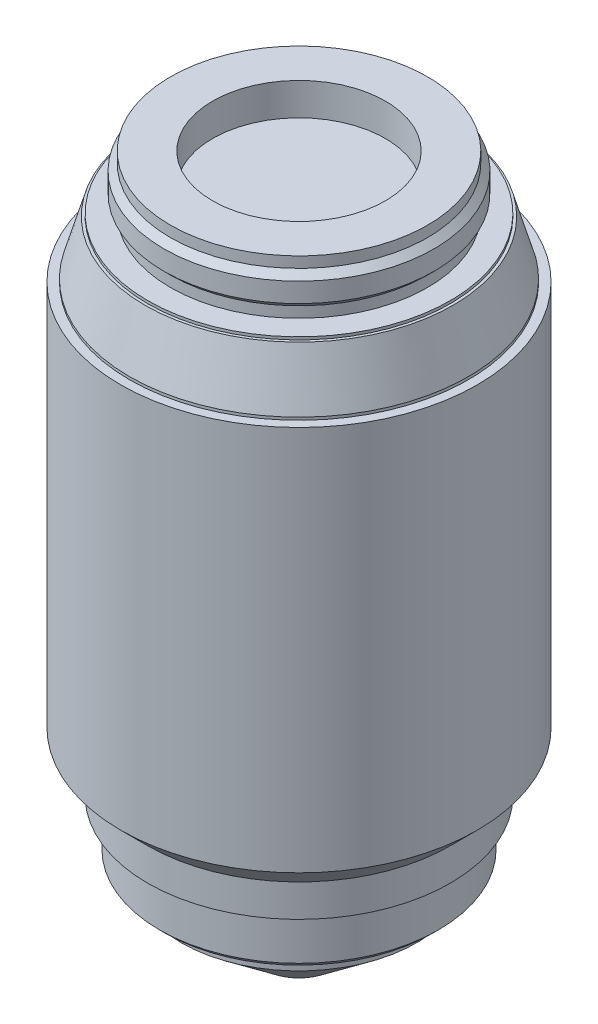
ISO-10303-21;
HEADER;
FILE_DESCRIPTION(('STEP AP214'),'2;1');
FILE_NAME('part.step','',(''),(''),'','','');
FILE_SCHEMA(('AUTOMOTIVE_DESIGN { 1 0 10303 214 1 1 1 1 }'));
ENDSEC;
DATA;
#1=APPLICATION_CONTEXT('core data for automotive mechanical design processes');
#2=APPLICATION_PROTOCOL_DEFINITION('international standard','automotive_design',2000,#1);
#3=PRODUCT_CONTEXT('',#1,'mechanical');
#4=PRODUCT('Part','Part','',(#3));
#5=PRODUCT_RELATED_PRODUCT_CATEGORY('part','',(#4));
#6=PRODUCT_DEFINITION_FORMATION('','',#4);
#7=PRODUCT_DEFINITION_CONTEXT('part definition',#1,'design');
#8=PRODUCT_DEFINITION('design','',#6,#7);
#9=PRODUCT_DEFINITION_SHAPE('','',#8);
#10=(LENGTH_UNIT() NAMED_UNIT(*) SI_UNIT(.MILLI.,.METRE.));
#11=(NAMED_UNIT(*) PLANE_ANGLE_UNIT() SI_UNIT($,.RADIAN.));
#12=(NAMED_UNIT(*) SI_UNIT($,.STERADIAN.) SOLID_ANGLE_UNIT());
#13=UNCERTAINTY_MEASURE_WITH_UNIT(LENGTH_MEASURE(1.E-05),#10,'distance_accuracy_value','');
#14=(GEOMETRIC_REPRESENTATION_CONTEXT(3) GLOBAL_UNCERTAINTY_ASSIGNED_CONTEXT((#13)) GLOBAL_UNIT_ASSIGNED_CONTEXT((#10,
#11,#12)) REPRESENTATION_CONTEXT('',''));
#15=CARTESIAN_POINT('',(0.,0.,0.));
#16=DIRECTION('',(0.,0.,1.));
#17=DIRECTION('',(1.,0.,0.));
#18=AXIS2_PLACEMENT_3D('',#15,#16,#17);
#19=CARTESIAN_POINT('',(0.,32.,11.9));
#20=DIRECTION('',(0.,1.,0.));
#21=DIRECTION('',(0.,0.,1.));
#22=AXIS2_PLACEMENT_3D('',#19,#20,#21);
#23=PLANE('',#22);
#24=CARTESIAN_POINT('',(0.,32.,0.));
#25=DIRECTION('',(0.,1.,0.));
#26=DIRECTION('',(0.,0.,1.));
#27=AXIS2_PLACEMENT_3D('',#24,#25,#26);
#28=CIRCLE('',#27,8.);
#29=CARTESIAN_POINT('',(0.,32.,8.00000000000001));
#30=VERTEX_POINT('',#29);
#31=EDGE_CURVE('E116',#30,#30,#28,.T.);
#32=ORIENTED_EDGE('',*,*,#31,.F.);
#33=EDGE_LOOP('',(#32));
#34=FACE_BOUND('',#33,.T.);
#35=CARTESIAN_POINT('',(0.,32.,0.));
#36=DIRECTION('',(0.,1.,0.));
#37=DIRECTION('',(0.,0.,1.));
#38=AXIS2_PLACEMENT_3D('',#35,#36,#37);
#39=CIRCLE('',#38,11.9);
#40=CARTESIAN_POINT('',(0.,32.,11.9));
#41=VERTEX_POINT('',#40);
#42=EDGE_CURVE('E112',#41,#41,#39,.T.);
#43=ORIENTED_EDGE('',*,*,#42,.T.);
#44=EDGE_LOOP('',(#43));
#45=FACE_BOUND('',#44,.T.);
#46=ADVANCED_FACE('F45',(#34,#45),#23,.T.);
#47=CARTESIAN_POINT('',(0.,-32.,0.));
#48=DIRECTION('',(0.,-1.,0.));
#49=DIRECTION('',(0.,0.,-1.));
#50=AXIS2_PLACEMENT_3D('',#47,#48,#49);
#51=PLANE('',#50);
#52=CARTESIAN_POINT('',(0.,-32.,0.));
#53=DIRECTION('',(0.,-1.,0.));
#54=DIRECTION('',(0.,0.,-1.));
#55=AXIS2_PLACEMENT_3D('',#52,#53,#54);
#56=CIRCLE('',#55,2.5);
#57=CARTESIAN_POINT('',(0.,-32.,-2.50000000000001));
#58=VERTEX_POINT('',#57);
#59=EDGE_CURVE('E122',#58,#58,#56,.T.);
#60=ORIENTED_EDGE('',*,*,#59,.F.);
#61=EDGE_LOOP('',(#60));
#62=FACE_BOUND('',#61,.T.);
#63=CARTESIAN_POINT('',(0.,-32.,0.));
#64=DIRECTION('',(0.,1.,0.));
#65=DIRECTION('',(0.,0.,1.));
#66=AXIS2_PLACEMENT_3D('',#63,#64,#65);
#67=CIRCLE('',#66,3.25);
#68=CARTESIAN_POINT('',(0.,-32.,3.24999999999999));
#69=VERTEX_POINT('',#68);
#70=EDGE_CURVE('E10',#69,#69,#67,.T.);
#71=ORIENTED_EDGE('',*,*,#70,.F.);
#72=EDGE_LOOP('',(#71));
#73=FACE_BOUND('',#72,.T.);
#74=ADVANCED_FACE('F137',(#62,#73),#51,.T.);
#75=CARTESIAN_POINT('',(0.,-26.0231649572236,0.));
#76=DIRECTION('',(0.,1.,0.));
#77=DIRECTION('',(0.,0.,1.));
#78=AXIS2_PLACEMENT_3D('',#75,#76,#77);
#79=CONICAL_SURFACE('',#78,10.9,0.90757121103705);
#80=CARTESIAN_POINT('',(0.,-26.0231649572236,0.));
#81=DIRECTION('',(0.,1.,0.));
#82=DIRECTION('',(0.,0.,1.));
#83=AXIS2_PLACEMENT_3D('',#80,#81,#82);
#84=CIRCLE('',#83,10.9);
#85=CARTESIAN_POINT('',(0.,-26.0231649572236,10.9));
#86=VERTEX_POINT('',#85);
#87=EDGE_CURVE('E51',#86,#86,#84,.T.);
#88=CARTESIAN_POINT('',(0.,-32.,3.24999999999999));
#89=CARTESIAN_POINT('',(0.,-31.9377413016378,3.32968749999999));
#90=CARTESIAN_POINT('',(0.,-31.8754826032755,3.40937499999999));
#91=CARTESIAN_POINT('',(0.,-31.750965206551,3.56874999999999));
#92=CARTESIAN_POINT('',(0.,-31.6887065081887,3.64843749999999));
#93=CARTESIAN_POINT('',(0.,-31.5641891114642,3.80781249999999));
#94=CARTESIAN_POINT('',(0.,-31.501930413102,3.88749999999999));
#95=CARTESIAN_POINT('',(0.,-31.3774130163775,4.04687499999999));
#96=CARTESIAN_POINT('',(0.,-31.3151543180152,4.12656249999999));
#97=CARTESIAN_POINT('',(0.,-31.1906369212907,4.28593749999999));
#98=CARTESIAN_POINT('',(0.,-31.1283782229284,4.36562499999999));
#99=CARTESIAN_POINT('',(0.,-31.0038608262039,4.52499999999999));
#100=CARTESIAN_POINT('',(0.,-30.9416021278417,4.60468749999999));
#101=CARTESIAN_POINT('',(0.,-30.8170847311172,4.76406249999999));
#102=CARTESIAN_POINT('',(0.,-30.7548260327549,4.84374999999999));
#103=CARTESIAN_POINT('',(0.,-30.6303086360304,5.00312499999999));
#104=CARTESIAN_POINT('',(0.,-30.5680499376682,5.08281249999999));
#105=CARTESIAN_POINT('',(0.,-30.4435325409437,5.24218749999999));
#106=CARTESIAN_POINT('',(0.,-30.3812738425814,5.32187499999999));
#107=CARTESIAN_POINT('',(0.,-30.2567564458569,5.48124999999999));
#108=CARTESIAN_POINT('',(0.,-30.1944977474946,5.56093749999999));
#109=CARTESIAN_POINT('',(0.,-30.0699803507701,5.72031249999999));
#110=CARTESIAN_POINT('',(0.,-30.0077216524079,5.79999999999999));
#111=CARTESIAN_POINT('',(0.,-29.8832042556834,5.95937499999999));
#112=CARTESIAN_POINT('',(0.,-29.8209455573211,6.03906249999999));
#113=CARTESIAN_POINT('',(0.,-29.6964281605966,6.19843749999999));
#114=CARTESIAN_POINT('',(0.,-29.6341694622344,6.27812499999999));
#115=CARTESIAN_POINT('',(0.,-29.5096520655098,6.43749999999999));
#116=CARTESIAN_POINT('',(0.,-29.4473933671476,6.51718749999999));
#117=CARTESIAN_POINT('',(0.,-29.3228759704231,6.67656249999999));
#118=CARTESIAN_POINT('',(0.,-29.2606172720608,6.75624999999999));
#119=CARTESIAN_POINT('',(0.,-29.1360998753363,6.91562499999999));
#120=CARTESIAN_POINT('',(0.,-29.0738411769741,6.99531249999999));
#121=CARTESIAN_POINT('',(0.,-28.9493237802496,7.15468749999999));
#122=CARTESIAN_POINT('',(0.,-28.8870650818873,7.23437499999999));
#123=CARTESIAN_POINT('',(0.,-28.7625476851628,7.39374999999999));
#124=CARTESIAN_POINT('',(0.,-28.7002889868005,7.47343749999999));
#125=CARTESIAN_POINT('',(0.,-28.575771590076,7.63281249999999));
#126=CARTESIAN_POINT('',(0.,-28.5135128917138,7.71249999999999));
#127=CARTESIAN_POINT('',(0.,-28.3889954949893,7.87187499999999));
#128=CARTESIAN_POINT('',(0.,-28.326736796627,7.95156249999999));
#129=CARTESIAN_POINT('',(0.,-28.2022193999025,8.11093749999999));
#130=CARTESIAN_POINT('',(0.,-28.1399607015402,8.19062499999999));
#131=CARTESIAN_POINT('',(0.,-28.0154433048157,8.34999999999999));
#132=CARTESIAN_POINT('',(0.,-27.9531846064535,8.42968749999999));
#133=CARTESIAN_POINT('',(0.,-27.828667209729,8.58906249999999));
#134=CARTESIAN_POINT('',(0.,-27.7664085113667,8.66874999999999));
#135=CARTESIAN_POINT('',(0.,-27.6418911146422,8.82812499999999));
#136=CARTESIAN_POINT('',(0.,-27.57963241628,8.90781249999999));
#137=CARTESIAN_POINT('',(0.,-27.4551150195554,9.06718749999999));
#138=CARTESIAN_POINT('',(0.,-27.3928563211932,9.146875));
#139=CARTESIAN_POINT('',(0.,-27.2683389244687,9.30625));
#140=CARTESIAN_POINT('',(0.,-27.2060802261064,9.3859375));
#141=CARTESIAN_POINT('',(0.,-27.0815628293819,9.54531249999999));
#142=CARTESIAN_POINT('',(0.,-27.0193041310197,9.62499999999999));
#143=CARTESIAN_POINT('',(0.,-26.8947867342952,9.78437499999999));
#144=CARTESIAN_POINT('',(0.,-26.8325280359329,9.86406249999999));
#145=CARTESIAN_POINT('',(0.,-26.7080106392084,10.0234375));
#146=CARTESIAN_POINT('',(0.,-26.6457519408461,10.103125));
#147=CARTESIAN_POINT('',(0.,-26.5212345441216,10.2625));
#148=CARTESIAN_POINT('',(0.,-26.4589758457594,10.3421875));
#149=CARTESIAN_POINT('',(0.,-26.3344584490349,10.5015625));
#150=CARTESIAN_POINT('',(0.,-26.2721997506726,10.58125));
#151=CARTESIAN_POINT('',(0.,-26.1476823539481,10.740625));
#152=CARTESIAN_POINT('',(0.,-26.0854236555859,10.8203125));
#153=CARTESIAN_POINT('',(0.,-26.0231649572236,10.9));
#154=B_SPLINE_CURVE_WITH_KNOTS('',3,(#88,#89,#90,#91,#92,#93,#94,#95,#96,#97,#98,#99,#100,#101,
#102,#103,#104,#105,#106,#107,#108,#109,#110,#111,#112,#113,#114,#115,#116,#117,#118,#119,#120,
#121,#122,#123,#124,#125,#126,#127,#128,#129,#130,#131,#132,#133,#134,#135,#136,#137,#138,#139,
#140,#141,#142,#143,#144,#145,#146,#147,#148,#149,#150,#151,#152,#153),.UNSPECIFIED.,.F.,.F.,(4,
2,2,2,2,2,2,2,2,2,2,2,2,2,2,2,2,2,2,2,2,2,2,2,2,2,2,2,2,2,2,2,4),(0.,0.30337466704079,
0.60674933408158,0.91012400112237,1.21349866816316,1.51687333520395,1.82024800224474,
2.12362266928553,2.42699733632632,2.7303720033671,3.03374667040789,3.33712133744868,
3.64049600448947,3.94387067153026,4.24724533857105,4.55062000561184,4.85399467265263,
5.15736933969341,5.4607440067342,5.76411867377499,6.06749334081578,6.37086800785657,
6.67424267489736,6.97761734193815,7.28099200897894,7.58436667601973,7.88774134306051,
8.1911160101013,8.49449067714209,8.79786534418288,9.10124001122367,9.40461467826446,
9.70798934530525),.UNSPECIFIED.);
#155=EDGE_CURVE('BSEAM140',#69,#86,#154,.T.);
#156=ORIENTED_EDGE('',*,*,#70,.T.);
#157=ORIENTED_EDGE('',*,*,#87,.F.);
#158=ORIENTED_EDGE('',*,*,#155,.T.);
#159=ORIENTED_EDGE('',*,*,#155,.F.);
#160=EDGE_LOOP('',(#156,#158,#157,#159));
#161=FACE_BOUND('',#160,.T.);
#162=ADVANCED_FACE('F140',(#161),#79,.T.);
#163=CARTESIAN_POINT('',(0.,40.,0.));
#164=DIRECTION('',(0.,1.,0.));
#165=DIRECTION('',(0.,0.,1.));
#166=AXIS2_PLACEMENT_3D('',#163,#164,#165);
#167=CYLINDRICAL_SURFACE('',#166,10.9);
#168=ORIENTED_EDGE('',*,*,#87,.T.);
#169=EDGE_LOOP('',(#168));
#170=FACE_BOUND('',#169,.T.);
#171=CARTESIAN_POINT('',(0.,-24.5,0.));
#172=DIRECTION('',(0.,1.,0.));
#173=DIRECTION('',(0.,0.,1.));
#174=AXIS2_PLACEMENT_3D('',#171,#172,#173);
#175=CIRCLE('',#174,10.9);
#176=CARTESIAN_POINT('',(0.,-24.5,10.9));
#177=VERTEX_POINT('',#176);
#178=EDGE_CURVE('E55',#177,#177,#175,.T.);
#179=ORIENTED_EDGE('',*,*,#178,.F.);
#180=EDGE_LOOP('',(#179));
#181=FACE_BOUND('',#180,.T.);
#182=ADVANCED_FACE('F145',(#170,#181),#167,.T.);
#183=CARTESIAN_POINT('',(0.,-24.5,10.9));
#184=DIRECTION('',(0.,-1.,0.));
#185=DIRECTION('',(0.,0.,-1.));
#186=AXIS2_PLACEMENT_3D('',#183,#184,#185);
#187=PLANE('',#186);
#188=ORIENTED_EDGE('',*,*,#178,.T.);
#189=EDGE_LOOP('',(#188));
#190=FACE_BOUND('',#189,.T.);
#191=CARTESIAN_POINT('',(0.,-24.5,0.));
#192=DIRECTION('',(0.,1.,0.));
#193=DIRECTION('',(0.,0.,1.));
#194=AXIS2_PLACEMENT_3D('',#191,#192,#193);
#195=CIRCLE('',#194,12.4);
#196=CARTESIAN_POINT('',(0.,-24.5,12.4));
#197=VERTEX_POINT('',#196);
#198=EDGE_CURVE('E59',#197,#197,#195,.T.);
#199=ORIENTED_EDGE('',*,*,#198,.F.);
#200=EDGE_LOOP('',(#199));
#201=FACE_BOUND('',#200,.T.);
#202=ADVANCED_FACE('F152',(#190,#201),#187,.T.);
#203=CARTESIAN_POINT('',(0.,-24.,0.));
#204=DIRECTION('',(0.,1.,0.));
#205=DIRECTION('',(0.,0.,1.));
#206=AXIS2_PLACEMENT_3D('',#203,#204,#205);
#207=CONICAL_SURFACE('',#206,12.9,0.785398163397447);
#208=ORIENTED_EDGE('',*,*,#198,.T.);
#209=EDGE_LOOP('',(#208));
#210=FACE_BOUND('',#209,.T.);
#211=CARTESIAN_POINT('',(0.,-24.,0.));
#212=DIRECTION('',(0.,1.,0.));
#213=DIRECTION('',(0.,0.,1.));
#214=AXIS2_PLACEMENT_3D('',#211,#212,#213);
#215=CIRCLE('',#214,12.9);
#216=CARTESIAN_POINT('',(0.,-24.,12.9));
#217=VERTEX_POINT('',#216);
#218=EDGE_CURVE('E64',#217,#217,#215,.T.);
#219=ORIENTED_EDGE('',*,*,#218,.F.);
#220=EDGE_LOOP('',(#219));
#221=FACE_BOUND('',#220,.T.);
#222=ADVANCED_FACE('F155',(#210,#221),#207,.T.);
#223=CARTESIAN_POINT('',(0.,40.,0.));
#224=DIRECTION('',(0.,1.,0.));
#225=DIRECTION('',(0.,0.,1.));
#226=AXIS2_PLACEMENT_3D('',#223,#224,#225);
#227=CYLINDRICAL_SURFACE('',#226,12.9);
#228=ORIENTED_EDGE('',*,*,#218,.T.);
#229=EDGE_LOOP('',(#228));
#230=FACE_BOUND('',#229,.T.);
#231=CARTESIAN_POINT('',(0.,-19.7,0.));
#232=DIRECTION('',(0.,1.,0.));
#233=DIRECTION('',(0.,0.,1.));
#234=AXIS2_PLACEMENT_3D('',#231,#232,#233);
#235=CIRCLE('',#234,12.9);
#236=CARTESIAN_POINT('',(0.,-19.7,12.9));
#237=VERTEX_POINT('',#236);
#238=EDGE_CURVE('E67',#237,#237,#235,.T.);
#239=ORIENTED_EDGE('',*,*,#238,.F.);
#240=EDGE_LOOP('',(#239));
#241=FACE_BOUND('',#240,.T.);
#242=ADVANCED_FACE('F159',(#230,#241),#227,.T.);
#243=CARTESIAN_POINT('',(0.,-19.7,12.9));
#244=DIRECTION('',(0.,-1.,0.));
#245=DIRECTION('',(0.,0.,-1.));
#246=AXIS2_PLACEMENT_3D('',#243,#244,#245);
#247=PLANE('',#246);
#248=ORIENTED_EDGE('',*,*,#238,.T.);
#249=EDGE_LOOP('',(#248));
#250=FACE_BOUND('',#249,.T.);
#251=CARTESIAN_POINT('',(0.,-19.7,0.));
#252=DIRECTION('',(0.,1.,0.));
#253=DIRECTION('',(0.,0.,1.));
#254=AXIS2_PLACEMENT_3D('',#251,#252,#253);
#255=CIRCLE('',#254,14.);
#256=CARTESIAN_POINT('',(0.,-19.7,14.));
#257=VERTEX_POINT('',#256);
#258=EDGE_CURVE('E70',#257,#257,#255,.T.);
#259=ORIENTED_EDGE('',*,*,#258,.F.);
#260=EDGE_LOOP('',(#259));
#261=FACE_BOUND('',#260,.T.);
#262=ADVANCED_FACE('F163',(#250,#261),#247,.T.);
#263=CARTESIAN_POINT('',(0.,40.,0.));
#264=DIRECTION('',(0.,1.,0.));
#265=DIRECTION('',(0.,0.,1.));
#266=AXIS2_PLACEMENT_3D('',#263,#264,#265);
#267=CYLINDRICAL_SURFACE('',#266,14.);
#268=ORIENTED_EDGE('',*,*,#258,.T.);
#269=EDGE_LOOP('',(#268));
#270=FACE_BOUND('',#269,.T.);
#271=CARTESIAN_POINT('',(0.,-16.7,0.));
#272=DIRECTION('',(0.,1.,0.));
#273=DIRECTION('',(0.,0.,1.));
#274=AXIS2_PLACEMENT_3D('',#271,#272,#273);
#275=CIRCLE('',#274,14.);
#276=CARTESIAN_POINT('',(0.,-16.7,14.));
#277=VERTEX_POINT('',#276);
#278=EDGE_CURVE('E73',#277,#277,#275,.T.);
#279=ORIENTED_EDGE('',*,*,#278,.F.);
#280=EDGE_LOOP('',(#279));
#281=FACE_BOUND('',#280,.T.);
#282=ADVANCED_FACE('F167',(#270,#281),#267,.T.);
#283=CARTESIAN_POINT('',(0.,-14.2,0.));
#284=DIRECTION('',(0.,1.,0.));
#285=DIRECTION('',(0.,0.,1.));
#286=AXIS2_PLACEMENT_3D('',#283,#284,#285);
#287=CONICAL_SURFACE('',#286,16.5,0.785398163397447);
#288=ORIENTED_EDGE('',*,*,#278,.T.);
#289=EDGE_LOOP('',(#288));
#290=FACE_BOUND('',#289,.T.);
#291=CARTESIAN_POINT('',(0.,-14.2,0.));
#292=DIRECTION('',(0.,1.,0.));
#293=DIRECTION('',(0.,0.,1.));
#294=AXIS2_PLACEMENT_3D('',#291,#292,#293);
#295=CIRCLE('',#294,16.5);
#296=CARTESIAN_POINT('',(0.,-14.2,16.5));
#297=VERTEX_POINT('',#296);
#298=EDGE_CURVE('E76',#297,#297,#295,.T.);
#299=ORIENTED_EDGE('',*,*,#298,.F.);
#300=EDGE_LOOP('',(#299));
#301=FACE_BOUND('',#300,.T.);
#302=ADVANCED_FACE('F171',(#290,#301),#287,.T.);
#303=CARTESIAN_POINT('',(0.,40.,0.));
#304=DIRECTION('',(0.,1.,0.));
#305=DIRECTION('',(0.,0.,1.));
#306=AXIS2_PLACEMENT_3D('',#303,#304,#305);
#307=CYLINDRICAL_SURFACE('',#306,16.5);
#308=ORIENTED_EDGE('',*,*,#298,.T.);
#309=EDGE_LOOP('',(#308));
#310=FACE_BOUND('',#309,.T.);
#311=CARTESIAN_POINT('',(0.,21.5,0.));
#312=DIRECTION('',(0.,1.,0.));
#313=DIRECTION('',(0.,0.,1.));
#314=AXIS2_PLACEMENT_3D('',#311,#312,#313);
#315=CIRCLE('',#314,16.5);
#316=CARTESIAN_POINT('',(0.,21.5,16.5));
#317=VERTEX_POINT('',#316);
#318=EDGE_CURVE('E79',#317,#317,#315,.T.);
#319=ORIENTED_EDGE('',*,*,#318,.F.);
#320=EDGE_LOOP('',(#319));
#321=FACE_BOUND('',#320,.T.);
#322=ADVANCED_FACE('F175',(#310,#321),#307,.T.);
#323=CARTESIAN_POINT('',(0.,21.5,16.5));
#324=DIRECTION('',(0.,1.,0.));
#325=DIRECTION('',(0.,0.,1.));
#326=AXIS2_PLACEMENT_3D('',#323,#324,#325);
#327=PLANE('',#326);
#328=ORIENTED_EDGE('',*,*,#318,.T.);
#329=EDGE_LOOP('',(#328));
#330=FACE_BOUND('',#329,.T.);
#331=CARTESIAN_POINT('',(0.,21.5,0.));
#332=DIRECTION('',(0.,1.,0.));
#333=DIRECTION('',(0.,0.,1.));
#334=AXIS2_PLACEMENT_3D('',#331,#332,#333);
#335=CIRCLE('',#334,15.683726928794);
#336=CARTESIAN_POINT('',(0.,21.5,15.683726928794));
#337=VERTEX_POINT('',#336);
#338=EDGE_CURVE('E82',#337,#337,#335,.T.);
#339=ORIENTED_EDGE('',*,*,#338,.F.);
#340=EDGE_LOOP('',(#339));
#341=FACE_BOUND('',#340,.T.);
#342=ADVANCED_FACE('F179',(#330,#341),#327,.T.);
#343=CARTESIAN_POINT('',(0.,40.,0.));
#344=DIRECTION('',(0.,1.,0.));
#345=DIRECTION('',(0.,0.,1.));
#346=AXIS2_PLACEMENT_3D('',#343,#344,#345);
#347=CYLINDRICAL_SURFACE('',#346,15.683726928794);
#348=ORIENTED_EDGE('',*,*,#338,.T.);
#349=EDGE_LOOP('',(#348));
#350=FACE_BOUND('',#349,.T.);
#351=CARTESIAN_POINT('',(0.,21.75,0.));
#352=DIRECTION('',(0.,1.,0.));
#353=DIRECTION('',(0.,0.,1.));
#354=AXIS2_PLACEMENT_3D('',#351,#352,#353);
#355=CIRCLE('',#354,15.683726928794);
#356=CARTESIAN_POINT('',(0.,21.75,15.683726928794));
#357=VERTEX_POINT('',#356);
#358=EDGE_CURVE('E85',#357,#357,#355,.T.);
#359=ORIENTED_EDGE('',*,*,#358,.F.);
#360=EDGE_LOOP('',(#359));
#361=FACE_BOUND('',#360,.T.);
#362=ADVANCED_FACE('F183',(#350,#361),#347,.T.);
#363=CARTESIAN_POINT('',(0.,26.75,0.));
#364=DIRECTION('',(0.,-1.,0.));
#365=DIRECTION('',(0.,0.,-1.));
#366=AXIS2_PLACEMENT_3D('',#363,#364,#365);
#367=CONICAL_SURFACE('',#366,14.25,0.27925268031909);
#368=ORIENTED_EDGE('',*,*,#358,.T.);
#369=EDGE_LOOP('',(#368));
#370=FACE_BOUND('',#369,.T.);
#371=CARTESIAN_POINT('',(0.,26.75,0.));
#372=DIRECTION('',(0.,1.,0.));
#373=DIRECTION('',(0.,0.,1.));
#374=AXIS2_PLACEMENT_3D('',#371,#372,#373);
#375=CIRCLE('',#374,14.25);
#376=CARTESIAN_POINT('',(0.,26.75,14.25));
#377=VERTEX_POINT('',#376);
#378=EDGE_CURVE('E88',#377,#377,#375,.T.);
#379=ORIENTED_EDGE('',*,*,#378,.F.);
#380=EDGE_LOOP('',(#379));
#381=FACE_BOUND('',#380,.T.);
#382=ADVANCED_FACE('F187',(#370,#381),#367,.T.);
#383=CARTESIAN_POINT('',(0.,26.75,14.25));
#384=DIRECTION('',(0.,1.,0.));
#385=DIRECTION('',(0.,0.,1.));
#386=AXIS2_PLACEMENT_3D('',#383,#384,#385);
#387=PLANE('',#386);
#388=ORIENTED_EDGE('',*,*,#378,.T.);
#389=EDGE_LOOP('',(#388));
#390=FACE_BOUND('',#389,.T.);
#391=CARTESIAN_POINT('',(0.,26.75,0.));
#392=DIRECTION('',(0.,1.,0.));
#393=DIRECTION('',(0.,0.,1.));
#394=AXIS2_PLACEMENT_3D('',#391,#392,#393);
#395=CIRCLE('',#394,14.);
#396=CARTESIAN_POINT('',(0.,26.75,14.));
#397=VERTEX_POINT('',#396);
#398=EDGE_CURVE('E91',#397,#397,#395,.T.);
#399=ORIENTED_EDGE('',*,*,#398,.F.);
#400=EDGE_LOOP('',(#399));
#401=FACE_BOUND('',#400,.T.);
#402=ADVANCED_FACE('F191',(#390,#401),#387,.T.);
#403=CARTESIAN_POINT('',(0.,40.,0.));
#404=DIRECTION('',(0.,1.,0.));
#405=DIRECTION('',(0.,0.,1.));
#406=AXIS2_PLACEMENT_3D('',#403,#404,#405);
#407=CYLINDRICAL_SURFACE('',#406,14.);
#408=ORIENTED_EDGE('',*,*,#398,.T.);
#409=EDGE_LOOP('',(#408));
#410=FACE_BOUND('',#409,.T.);
#411=CARTESIAN_POINT('',(0.,27.,0.));
#412=DIRECTION('',(0.,1.,0.));
#413=DIRECTION('',(0.,0.,1.));
#414=AXIS2_PLACEMENT_3D('',#411,#412,#413);
#415=CIRCLE('',#414,14.);
#416=CARTESIAN_POINT('',(0.,27.,14.));
#417=VERTEX_POINT('',#416);
#418=EDGE_CURVE('E94',#417,#417,#415,.T.);
#419=ORIENTED_EDGE('',*,*,#418,.F.);
#420=EDGE_LOOP('',(#419));
#421=FACE_BOUND('',#420,.T.);
#422=ADVANCED_FACE('F195',(#410,#421),#407,.T.);
#423=CARTESIAN_POINT('',(0.,27.,14.));
#424=DIRECTION('',(0.,1.,0.));
#425=DIRECTION('',(0.,0.,1.));
#426=AXIS2_PLACEMENT_3D('',#423,#424,#425);
#427=PLANE('',#426);
#428=ORIENTED_EDGE('',*,*,#418,.T.);
#429=EDGE_LOOP('',(#428));
#430=FACE_BOUND('',#429,.T.);
#431=CARTESIAN_POINT('',(0.,27.,0.));
#432=DIRECTION('',(0.,1.,0.));
#433=DIRECTION('',(0.,0.,1.));
#434=AXIS2_PLACEMENT_3D('',#431,#432,#433);
#435=CIRCLE('',#434,11.9);
#436=CARTESIAN_POINT('',(0.,27.,11.9));
#437=VERTEX_POINT('',#436);
#438=EDGE_CURVE('E97',#437,#437,#435,.T.);
#439=ORIENTED_EDGE('',*,*,#438,.F.);
#440=EDGE_LOOP('',(#439));
#441=FACE_BOUND('',#440,.T.);
#442=ADVANCED_FACE('F199',(#430,#441),#427,.T.);
#443=CARTESIAN_POINT('',(0.,40.,0.));
#444=DIRECTION('',(0.,1.,0.));
#445=DIRECTION('',(0.,0.,1.));
#446=AXIS2_PLACEMENT_3D('',#443,#444,#445);
#447=CYLINDRICAL_SURFACE('',#446,11.9);
#448=ORIENTED_EDGE('',*,*,#438,.T.);
#449=EDGE_LOOP('',(#448));
#450=FACE_BOUND('',#449,.T.);
#451=CARTESIAN_POINT('',(0.,28.,0.));
#452=DIRECTION('',(0.,1.,0.));
#453=DIRECTION('',(0.,0.,1.));
#454=AXIS2_PLACEMENT_3D('',#451,#452,#453);
#455=CIRCLE('',#454,11.9);
#456=CARTESIAN_POINT('',(0.,28.,11.9));
#457=VERTEX_POINT('',#456);
#458=EDGE_CURVE('E100',#457,#457,#455,.T.);
#459=ORIENTED_EDGE('',*,*,#458,.F.);
#460=EDGE_LOOP('',(#459));
#461=FACE_BOUND('',#460,.T.);
#462=ADVANCED_FACE('F203',(#450,#461),#447,.T.);
#463=CARTESIAN_POINT('',(0.,28.6,0.));
#464=DIRECTION('',(0.,1.,0.));
#465=DIRECTION('',(0.,0.,1.));
#466=AXIS2_PLACEMENT_3D('',#463,#464,#465);
#467=CONICAL_SURFACE('',#466,12.5,0.785398163397444);
#468=ORIENTED_EDGE('',*,*,#458,.T.);
#469=EDGE_LOOP('',(#468));
#470=FACE_BOUND('',#469,.T.);
#471=CARTESIAN_POINT('',(0.,28.6,0.));
#472=DIRECTION('',(0.,1.,0.));
#473=DIRECTION('',(0.,0.,1.));
#474=AXIS2_PLACEMENT_3D('',#471,#472,#473);
#475=CIRCLE('',#474,12.5);
#476=CARTESIAN_POINT('',(0.,28.6,12.5));
#477=VERTEX_POINT('',#476);
#478=EDGE_CURVE('E103',#477,#477,#475,.T.);
#479=ORIENTED_EDGE('',*,*,#478,.F.);
#480=EDGE_LOOP('',(#479));
#481=FACE_BOUND('',#480,.T.);
#482=ADVANCED_FACE('F207',(#470,#481),#467,.T.);
#483=CARTESIAN_POINT('',(0.,40.,0.));
#484=DIRECTION('',(0.,1.,0.));
#485=DIRECTION('',(0.,0.,1.));
#486=AXIS2_PLACEMENT_3D('',#483,#484,#485);
#487=CYLINDRICAL_SURFACE('',#486,12.5);
#488=ORIENTED_EDGE('',*,*,#478,.T.);
#489=EDGE_LOOP('',(#488));
#490=FACE_BOUND('',#489,.T.);
#491=CARTESIAN_POINT('',(0.,30.4,0.));
#492=DIRECTION('',(0.,1.,0.));
#493=DIRECTION('',(0.,0.,1.));
#494=AXIS2_PLACEMENT_3D('',#491,#492,#493);
#495=CIRCLE('',#494,12.5);
#496=CARTESIAN_POINT('',(0.,30.4,12.5));
#497=VERTEX_POINT('',#496);
#498=EDGE_CURVE('E106',#497,#497,#495,.T.);
#499=ORIENTED_EDGE('',*,*,#498,.F.);
#500=EDGE_LOOP('',(#499));
#501=FACE_BOUND('',#500,.T.);
#502=ADVANCED_FACE('F211',(#490,#501),#487,.T.);
#503=CARTESIAN_POINT('',(0.,31.,0.));
#504=DIRECTION('',(0.,-1.,0.));
#505=DIRECTION('',(0.,0.,-1.));
#506=AXIS2_PLACEMENT_3D('',#503,#504,#505);
#507=CONICAL_SURFACE('',#506,11.9,0.785398163397451);
#508=ORIENTED_EDGE('',*,*,#498,.T.);
#509=EDGE_LOOP('',(#508));
#510=FACE_BOUND('',#509,.T.);
#511=CARTESIAN_POINT('',(0.,31.,0.));
#512=DIRECTION('',(0.,1.,0.));
#513=DIRECTION('',(0.,0.,1.));
#514=AXIS2_PLACEMENT_3D('',#511,#512,#513);
#515=CIRCLE('',#514,11.9);
#516=CARTESIAN_POINT('',(0.,31.,11.9));
#517=VERTEX_POINT('',#516);
#518=EDGE_CURVE('E109',#517,#517,#515,.T.);
#519=ORIENTED_EDGE('',*,*,#518,.F.);
#520=EDGE_LOOP('',(#519));
#521=FACE_BOUND('',#520,.T.);
#522=ADVANCED_FACE('F215',(#510,#521),#507,.T.);
#523=CARTESIAN_POINT('',(0.,40.,0.));
#524=DIRECTION('',(0.,1.,0.));
#525=DIRECTION('',(0.,0.,1.));
#526=AXIS2_PLACEMENT_3D('',#523,#524,#525);
#527=CYLINDRICAL_SURFACE('',#526,11.9);
#528=ORIENTED_EDGE('',*,*,#518,.T.);
#529=EDGE_LOOP('',(#528));
#530=FACE_BOUND('',#529,.T.);
#531=ORIENTED_EDGE('',*,*,#42,.F.);
#532=EDGE_LOOP('',(#531));
#533=FACE_BOUND('',#532,.T.);
#534=ADVANCED_FACE('F219',(#530,#533),#527,.T.);
#535=CARTESIAN_POINT('',(0.,29.,0.));
#536=DIRECTION('',(0.,1.,0.));
#537=DIRECTION('',(0.,0.,1.));
#538=AXIS2_PLACEMENT_3D('',#535,#536,#537);
#539=CYLINDRICAL_SURFACE('',#538,8.);
#540=CARTESIAN_POINT('',(0.,29.,0.));
#541=DIRECTION('',(0.,1.,0.));
#542=DIRECTION('',(0.,0.,1.));
#543=AXIS2_PLACEMENT_3D('',#540,#541,#542);
#544=CIRCLE('',#543,8.);
#545=CARTESIAN_POINT('',(0.,29.,8.00000000000001));
#546=VERTEX_POINT('',#545);
#547=EDGE_CURVE('E115',#546,#546,#544,.T.);
#548=ORIENTED_EDGE('',*,*,#547,.F.);
#549=EDGE_LOOP('',(#548));
#550=FACE_BOUND('',#549,.T.);
#551=ORIENTED_EDGE('',*,*,#31,.T.);
#552=EDGE_LOOP('',(#551));
#553=FACE_BOUND('',#552,.T.);
#554=ADVANCED_FACE('F223',(#550,#553),#539,.F.);
#555=CARTESIAN_POINT('',(0.,29.,0.));
#556=DIRECTION('',(0.,1.,0.));
#557=DIRECTION('',(0.,0.,1.));
#558=AXIS2_PLACEMENT_3D('',#555,#556,#557);
#559=PLANE('',#558);
#560=ORIENTED_EDGE('',*,*,#547,.T.);
#561=EDGE_LOOP('',(#560));
#562=FACE_BOUND('',#561,.T.);
#563=ADVANCED_FACE('F133',(#562),#559,.T.);
#564=CARTESIAN_POINT('',(0.,-31.99,0.));
#565=DIRECTION('',(0.,-1.,0.));
#566=DIRECTION('',(0.,0.,-1.));
#567=AXIS2_PLACEMENT_3D('',#564,#565,#566);
#568=CYLINDRICAL_SURFACE('',#567,2.5);
#569=CARTESIAN_POINT('',(0.,-31.99,0.));
#570=DIRECTION('',(0.,-1.,0.));
#571=DIRECTION('',(0.,0.,-1.));
#572=AXIS2_PLACEMENT_3D('',#569,#570,#571);
#573=CIRCLE('',#572,2.5);
#574=CARTESIAN_POINT('',(0.,-31.99,-2.50000000000001));
#575=VERTEX_POINT('',#574);
#576=EDGE_CURVE('E119',#575,#575,#573,.T.);
#577=CARTESIAN_POINT('',(0.,-31.99,-2.50000000000001));
#578=CARTESIAN_POINT('',(0.,-31.9901041666667,-2.50000000000001));
#579=CARTESIAN_POINT('',(0.,-31.9902083333333,-2.50000000000001));
#580=CARTESIAN_POINT('',(0.,-31.9904166666667,-2.50000000000001));
#581=CARTESIAN_POINT('',(0.,-31.9905208333333,-2.50000000000001));
#582=CARTESIAN_POINT('',(0.,-31.9907291666667,-2.50000000000001));
#583=CARTESIAN_POINT('',(0.,-31.9908333333333,-2.50000000000001));
#584=CARTESIAN_POINT('',(0.,-31.9910416666667,-2.50000000000001));
#585=CARTESIAN_POINT('',(0.,-31.9911458333333,-2.50000000000001));
#586=CARTESIAN_POINT('',(0.,-31.9913541666667,-2.50000000000001));
#587=CARTESIAN_POINT('',(0.,-31.9914583333333,-2.50000000000001));
#588=CARTESIAN_POINT('',(0.,-31.9916666666667,-2.50000000000001));
#589=CARTESIAN_POINT('',(0.,-31.9917708333333,-2.50000000000001));
#590=CARTESIAN_POINT('',(0.,-31.9919791666667,-2.50000000000001));
#591=CARTESIAN_POINT('',(0.,-31.9920833333333,-2.50000000000001));
#592=CARTESIAN_POINT('',(0.,-31.9922916666667,-2.50000000000001));
#593=CARTESIAN_POINT('',(0.,-31.9923958333333,-2.50000000000001));
#594=CARTESIAN_POINT('',(0.,-31.9926041666667,-2.50000000000001));
#595=CARTESIAN_POINT('',(0.,-31.9927083333333,-2.50000000000001));
#596=CARTESIAN_POINT('',(0.,-31.9929166666667,-2.50000000000001));
#597=CARTESIAN_POINT('',(0.,-31.9930208333333,-2.50000000000001));
#598=CARTESIAN_POINT('',(0.,-31.9932291666667,-2.50000000000001));
#599=CARTESIAN_POINT('',(0.,-31.9933333333333,-2.50000000000001));
#600=CARTESIAN_POINT('',(0.,-31.9935416666667,-2.50000000000001));
#601=CARTESIAN_POINT('',(0.,-31.9936458333333,-2.50000000000001));
#602=CARTESIAN_POINT('',(0.,-31.9938541666667,-2.50000000000001));
#603=CARTESIAN_POINT('',(0.,-31.9939583333333,-2.50000000000001));
#604=CARTESIAN_POINT('',(0.,-31.9941666666667,-2.50000000000001));
#605=CARTESIAN_POINT('',(0.,-31.9942708333333,-2.50000000000001));
#606=CARTESIAN_POINT('',(0.,-31.9944791666667,-2.50000000000001));
#607=CARTESIAN_POINT('',(0.,-31.9945833333333,-2.50000000000001));
#608=CARTESIAN_POINT('',(0.,-31.9947916666667,-2.50000000000001));
#609=CARTESIAN_POINT('',(0.,-31.9948958333333,-2.50000000000001));
#610=CARTESIAN_POINT('',(0.,-31.9951041666667,-2.50000000000001));
#611=CARTESIAN_POINT('',(0.,-31.9952083333333,-2.50000000000001));
#612=CARTESIAN_POINT('',(0.,-31.9954166666667,-2.50000000000001));
#613=CARTESIAN_POINT('',(0.,-31.9955208333333,-2.50000000000001));
#614=CARTESIAN_POINT('',(0.,-31.9957291666667,-2.50000000000001));
#615=CARTESIAN_POINT('',(0.,-31.9958333333333,-2.50000000000001));
#616=CARTESIAN_POINT('',(0.,-31.9960416666667,-2.50000000000001));
#617=CARTESIAN_POINT('',(0.,-31.9961458333333,-2.50000000000001));
#618=CARTESIAN_POINT('',(0.,-31.9963541666667,-2.50000000000001));
#619=CARTESIAN_POINT('',(0.,-31.9964583333333,-2.50000000000001));
#620=CARTESIAN_POINT('',(0.,-31.9966666666667,-2.50000000000001));
#621=CARTESIAN_POINT('',(0.,-31.9967708333333,-2.50000000000001));
#622=CARTESIAN_POINT('',(0.,-31.9969791666667,-2.50000000000001));
#623=CARTESIAN_POINT('',(0.,-31.9970833333333,-2.50000000000001));
#624=CARTESIAN_POINT('',(0.,-31.9972916666667,-2.50000000000001));
#625=CARTESIAN_POINT('',(0.,-31.9973958333333,-2.50000000000001));
#626=CARTESIAN_POINT('',(0.,-31.9976041666667,-2.50000000000001));
#627=CARTESIAN_POINT('',(0.,-31.9977083333333,-2.50000000000001));
#628=CARTESIAN_POINT('',(0.,-31.9979166666667,-2.50000000000001));
#629=CARTESIAN_POINT('',(0.,-31.9980208333333,-2.50000000000001));
#630=CARTESIAN_POINT('',(0.,-31.9982291666667,-2.50000000000001));
#631=CARTESIAN_POINT('',(0.,-31.9983333333333,-2.50000000000001));
#632=CARTESIAN_POINT('',(0.,-31.9985416666667,-2.50000000000001));
#633=CARTESIAN_POINT('',(0.,-31.9986458333333,-2.50000000000001));
#634=CARTESIAN_POINT('',(0.,-31.9988541666667,-2.50000000000001));
#635=CARTESIAN_POINT('',(0.,-31.9989583333333,-2.50000000000001));
#636=CARTESIAN_POINT('',(0.,-31.9991666666667,-2.50000000000001));
#637=CARTESIAN_POINT('',(0.,-31.9992708333333,-2.50000000000001));
#638=CARTESIAN_POINT('',(0.,-31.9994791666667,-2.50000000000001));
#639=CARTESIAN_POINT('',(0.,-31.9995833333333,-2.50000000000001));
#640=CARTESIAN_POINT('',(0.,-31.9997916666667,-2.50000000000001));
#641=CARTESIAN_POINT('',(0.,-31.9998958333333,-2.50000000000001));
#642=CARTESIAN_POINT('',(0.,-32.,-2.50000000000001));
#643=B_SPLINE_CURVE_WITH_KNOTS('',3,(#577,#578,#579,#580,#581,#582,#583,#584,#585,#586,#587,
#588,#589,#590,#591,#592,#593,#594,#595,#596,#597,#598,#599,#600,#601,#602,#603,#604,#605,#606,
#607,#608,#609,#610,#611,#612,#613,#614,#615,#616,#617,#618,#619,#620,#621,#622,#623,#624,#625,
#626,#627,#628,#629,#630,#631,#632,#633,#634,#635,#636,#637,#638,#639,#640,#641,#642),
.UNSPECIFIED.,.F.,.F.,(4,2,2,2,2,2,2,2,2,2,2,2,2,2,2,2,2,2,2,2,2,2,2,2,2,2,2,2,2,2,2,2,4),(0.,
0.000312500000002047,0.000625000000004095,0.000937500000006142,0.00125000000000125,
0.0015625000000033,0.00187500000000534,0.00218750000000739,0.0025000000000025,
0.00281250000000455,0.00312500000000659,0.0034375000000017,0.00375000000000375,
0.0040625000000058,0.00437500000000784,0.00468750000000295,0.005000000000005,
0.00531250000000705,0.00562500000000216,0.0059375000000042,0.00625000000000625,
0.0065625000000083,0.00687500000000341,0.00718750000000545,0.0075000000000075,
0.00781250000000261,0.00812500000000466,0.0084375000000067,0.00875000000000875,
0.00906250000000386,0.00937500000000591,0.00968750000000795,0.0100000000000031),.UNSPECIFIED.);
#644=EDGE_CURVE('BSEAM130',#575,#58,#643,.T.);
#645=ORIENTED_EDGE('',*,*,#576,.F.);
#646=ORIENTED_EDGE('',*,*,#59,.T.);
#647=ORIENTED_EDGE('',*,*,#644,.T.);
#648=ORIENTED_EDGE('',*,*,#644,.F.);
#649=EDGE_LOOP('',(#645,#647,#646,#648));
#650=FACE_BOUND('',#649,.T.);
#651=ADVANCED_FACE('F130',(#650),#568,.F.);
#652=CARTESIAN_POINT('',(0.,-31.99,0.));
#653=DIRECTION('',(0.,-1.,0.));
#654=DIRECTION('',(0.,0.,-1.));
#655=AXIS2_PLACEMENT_3D('',#652,#653,#654);
#656=PLANE('',#655);
#657=ORIENTED_EDGE('',*,*,#576,.T.);
#658=EDGE_LOOP('',(#657));
#659=FACE_BOUND('',#658,.T.);
#660=ADVANCED_FACE('F128',(#659),#656,.T.);
#661=CLOSED_SHELL('',(#46,#74,#162,#182,#202,#222,#242,#262,#282,#302,#322,#342,#362,#382,#402,
#422,#442,#462,#482,#502,#522,#534,#554,#563,#651,#660));
#662=MANIFOLD_SOLID_BREP('B2',#661);
#663=ADVANCED_BREP_SHAPE_REPRESENTATION('',(#18,#662),#14);
#664=SHAPE_DEFINITION_REPRESENTATION(#9,#663);
ENDSEC;
END-ISO-10303-21;
